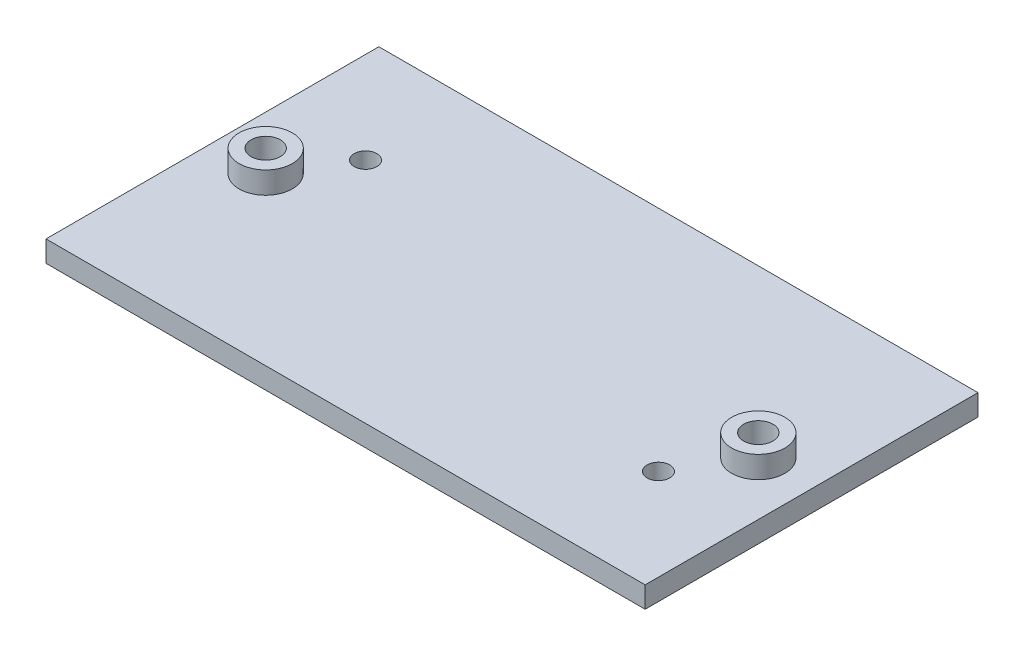
ISO-10303-21;
HEADER;
FILE_DESCRIPTION(('STEP AP214'),'2;1');
FILE_NAME('part.step','',(''),(''),'','','');
FILE_SCHEMA(('AUTOMOTIVE_DESIGN { 1 0 10303 214 1 1 1 1 }'));
ENDSEC;
DATA;
#1=APPLICATION_CONTEXT('core data for automotive mechanical design processes');
#2=APPLICATION_PROTOCOL_DEFINITION('international standard','automotive_design',2000,#1);
#3=PRODUCT_CONTEXT('',#1,'mechanical');
#4=PRODUCT('Part','Part','',(#3));
#5=PRODUCT_RELATED_PRODUCT_CATEGORY('part','',(#4));
#6=PRODUCT_DEFINITION_FORMATION('','',#4);
#7=PRODUCT_DEFINITION_CONTEXT('part definition',#1,'design');
#8=PRODUCT_DEFINITION('design','',#6,#7);
#9=PRODUCT_DEFINITION_SHAPE('','',#8);
#10=(LENGTH_UNIT() NAMED_UNIT(*) SI_UNIT(.MILLI.,.METRE.));
#11=(NAMED_UNIT(*) PLANE_ANGLE_UNIT() SI_UNIT($,.RADIAN.));
#12=(NAMED_UNIT(*) SI_UNIT($,.STERADIAN.) SOLID_ANGLE_UNIT());
#13=UNCERTAINTY_MEASURE_WITH_UNIT(LENGTH_MEASURE(1.E-05),#10,'distance_accuracy_value','');
#14=(GEOMETRIC_REPRESENTATION_CONTEXT(3) GLOBAL_UNCERTAINTY_ASSIGNED_CONTEXT((#13)) GLOBAL_UNIT_ASSIGNED_CONTEXT((#10,
#11,#12)) REPRESENTATION_CONTEXT('',''));
#15=CARTESIAN_POINT('',(0.,0.,0.));
#16=DIRECTION('',(0.,0.,1.));
#17=DIRECTION('',(1.,0.,0.));
#18=AXIS2_PLACEMENT_3D('',#15,#16,#17);
#19=CARTESIAN_POINT('',(0.,95.75,0.));
#20=DIRECTION('',(0.,-1.,0.));
#21=DIRECTION('',(0.,0.,-1.));
#22=AXIS2_PLACEMENT_3D('',#19,#20,#21);
#23=PLANE('',#22);
#24=CARTESIAN_POINT('',(-37.,95.75,0.));
#25=DIRECTION('',(0.,1.,0.));
#26=DIRECTION('',(0.,0.,1.));
#27=AXIS2_PLACEMENT_3D('',#24,#25,#26);
#28=CIRCLE('',#27,4.);
#29=CARTESIAN_POINT('',(-37.,95.75,-4.));
#30=VERTEX_POINT('',#29);
#31=EDGE_CURVE('E11',#30,#30,#28,.T.);
#32=ORIENTED_EDGE('',*,*,#31,.F.);
#33=EDGE_LOOP('',(#32));
#34=FACE_BOUND('',#33,.T.);
#35=CARTESIAN_POINT('',(37.,95.75,0.));
#36=DIRECTION('',(0.,1.,0.));
#37=DIRECTION('',(0.,0.,1.));
#38=AXIS2_PLACEMENT_3D('',#35,#36,#37);
#39=CIRCLE('',#38,4.);
#40=CARTESIAN_POINT('',(37.,95.75,-4.));
#41=VERTEX_POINT('',#40);
#42=EDGE_CURVE('E51',#41,#41,#39,.T.);
#43=ORIENTED_EDGE('',*,*,#42,.F.);
#44=EDGE_LOOP('',(#43));
#45=FACE_BOUND('',#44,.T.);
#46=DIRECTION('',(0.,0.,1.));
#47=VECTOR('',#46,1.);
#48=CARTESIAN_POINT('',(-45.,95.75,25.));
#49=LINE('',#48,#47);
#50=CARTESIAN_POINT('',(-45.,95.75,-25.));
#51=VERTEX_POINT('',#50);
#52=CARTESIAN_POINT('',(-45.,95.75,25.));
#53=VERTEX_POINT('',#52);
#54=EDGE_CURVE('E96',#51,#53,#49,.T.);
#55=ORIENTED_EDGE('',*,*,#54,.T.);
#56=DIRECTION('',(1.,0.,0.));
#57=VECTOR('',#56,1.);
#58=CARTESIAN_POINT('',(45.,95.75,25.));
#59=LINE('',#58,#57);
#60=CARTESIAN_POINT('',(45.,95.75,25.));
#61=VERTEX_POINT('',#60);
#62=EDGE_CURVE('E93',#53,#61,#59,.T.);
#63=ORIENTED_EDGE('',*,*,#62,.T.);
#64=DIRECTION('',(0.,0.,-1.));
#65=VECTOR('',#64,1.);
#66=CARTESIAN_POINT('',(45.,95.75,-25.));
#67=LINE('',#66,#65);
#68=CARTESIAN_POINT('',(45.,95.75,-25.));
#69=VERTEX_POINT('',#68);
#70=EDGE_CURVE('E94',#61,#69,#67,.T.);
#71=ORIENTED_EDGE('',*,*,#70,.T.);
#72=DIRECTION('',(-1.,0.,0.));
#73=VECTOR('',#72,1.);
#74=CARTESIAN_POINT('',(-45.,95.75,-25.));
#75=LINE('',#74,#73);
#76=EDGE_CURVE('E58',#69,#51,#75,.T.);
#77=ORIENTED_EDGE('',*,*,#76,.T.);
#78=EDGE_LOOP('',(#55,#63,#71,#77));
#79=FACE_BOUND('',#78,.T.);
#80=CARTESIAN_POINT('',(-31.25,95.75,-9.25));
#81=DIRECTION('',(0.,1.,0.));
#82=DIRECTION('',(0.,0.,1.));
#83=AXIS2_PLACEMENT_3D('',#80,#81,#82);
#84=CIRCLE('',#83,1.7);
#85=CARTESIAN_POINT('',(-31.25,95.75,-7.55));
#86=VERTEX_POINT('',#85);
#87=EDGE_CURVE('E129',#86,#86,#84,.T.);
#88=ORIENTED_EDGE('',*,*,#87,.F.);
#89=EDGE_LOOP('',(#88));
#90=FACE_BOUND('',#89,.T.);
#91=CARTESIAN_POINT('',(31.25,95.75,9.25));
#92=DIRECTION('',(0.,1.,0.));
#93=DIRECTION('',(0.,0.,1.));
#94=AXIS2_PLACEMENT_3D('',#91,#92,#93);
#95=CIRCLE('',#94,1.7);
#96=CARTESIAN_POINT('',(31.25,95.75,10.95));
#97=VERTEX_POINT('',#96);
#98=EDGE_CURVE('E135',#97,#97,#95,.T.);
#99=ORIENTED_EDGE('',*,*,#98,.F.);
#100=EDGE_LOOP('',(#99));
#101=FACE_BOUND('',#100,.T.);
#102=ADVANCED_FACE('F41',(#34,#45,#79,#90,#101),#23,.F.);
#103=CARTESIAN_POINT('',(0.,92.57,0.));
#104=DIRECTION('',(0.,-1.,0.));
#105=DIRECTION('',(0.,0.,-1.));
#106=AXIS2_PLACEMENT_3D('',#103,#104,#105);
#107=PLANE('',#106);
#108=CARTESIAN_POINT('',(-31.25,92.57,-9.25));
#109=DIRECTION('',(0.,1.,0.));
#110=DIRECTION('',(0.,0.,1.));
#111=AXIS2_PLACEMENT_3D('',#108,#109,#110);
#112=CIRCLE('',#111,1.7);
#113=CARTESIAN_POINT('',(-31.25,92.57,-7.55));
#114=VERTEX_POINT('',#113);
#115=EDGE_CURVE('E128',#114,#114,#112,.T.);
#116=ORIENTED_EDGE('',*,*,#115,.T.);
#117=EDGE_LOOP('',(#116));
#118=FACE_BOUND('',#117,.T.);
#119=CARTESIAN_POINT('',(-37.,92.57,0.));
#120=DIRECTION('',(0.,1.,0.));
#121=DIRECTION('',(0.,0.,1.));
#122=AXIS2_PLACEMENT_3D('',#119,#120,#121);
#123=CIRCLE('',#122,2.2);
#124=CARTESIAN_POINT('',(-37.,92.57,2.2));
#125=VERTEX_POINT('',#124);
#126=EDGE_CURVE('E115',#125,#125,#123,.T.);
#127=ORIENTED_EDGE('',*,*,#126,.T.);
#128=EDGE_LOOP('',(#127));
#129=FACE_BOUND('',#128,.T.);
#130=DIRECTION('',(0.,0.,1.));
#131=VECTOR('',#130,1.);
#132=CARTESIAN_POINT('',(-45.,92.57,25.));
#133=LINE('',#132,#131);
#134=CARTESIAN_POINT('',(-45.,92.57,-25.));
#135=VERTEX_POINT('',#134);
#136=CARTESIAN_POINT('',(-45.,92.57,25.));
#137=VERTEX_POINT('',#136);
#138=EDGE_CURVE('E108',#135,#137,#133,.T.);
#139=ORIENTED_EDGE('',*,*,#138,.F.);
#140=DIRECTION('',(-1.,0.,0.));
#141=VECTOR('',#140,1.);
#142=CARTESIAN_POINT('',(-45.,92.57,-25.));
#143=LINE('',#142,#141);
#144=CARTESIAN_POINT('',(45.,92.57,-25.));
#145=VERTEX_POINT('',#144);
#146=EDGE_CURVE('E84',#145,#135,#143,.T.);
#147=ORIENTED_EDGE('',*,*,#146,.F.);
#148=DIRECTION('',(0.,0.,-1.));
#149=VECTOR('',#148,1.);
#150=CARTESIAN_POINT('',(45.,92.57,-25.));
#151=LINE('',#150,#149);
#152=CARTESIAN_POINT('',(45.,92.57,25.));
#153=VERTEX_POINT('',#152);
#154=EDGE_CURVE('E76',#153,#145,#151,.T.);
#155=ORIENTED_EDGE('',*,*,#154,.F.);
#156=DIRECTION('',(1.,0.,0.));
#157=VECTOR('',#156,1.);
#158=CARTESIAN_POINT('',(45.,92.57,25.));
#159=LINE('',#158,#157);
#160=EDGE_CURVE('E101',#137,#153,#159,.T.);
#161=ORIENTED_EDGE('',*,*,#160,.F.);
#162=EDGE_LOOP('',(#139,#147,#155,#161));
#163=FACE_BOUND('',#162,.T.);
#164=CARTESIAN_POINT('',(37.,92.57,0.));
#165=DIRECTION('',(0.,1.,0.));
#166=DIRECTION('',(0.,0.,1.));
#167=AXIS2_PLACEMENT_3D('',#164,#165,#166);
#168=CIRCLE('',#167,2.2);
#169=CARTESIAN_POINT('',(37.,92.57,2.2));
#170=VERTEX_POINT('',#169);
#171=EDGE_CURVE('E127',#170,#170,#168,.T.);
#172=ORIENTED_EDGE('',*,*,#171,.T.);
#173=EDGE_LOOP('',(#172));
#174=FACE_BOUND('',#173,.T.);
#175=CARTESIAN_POINT('',(31.25,92.57,9.25));
#176=DIRECTION('',(0.,1.,0.));
#177=DIRECTION('',(0.,0.,1.));
#178=AXIS2_PLACEMENT_3D('',#175,#176,#177);
#179=CIRCLE('',#178,1.7);
#180=CARTESIAN_POINT('',(31.25,92.57,10.95));
#181=VERTEX_POINT('',#180);
#182=EDGE_CURVE('E136',#181,#181,#179,.T.);
#183=ORIENTED_EDGE('',*,*,#182,.T.);
#184=EDGE_LOOP('',(#183));
#185=FACE_BOUND('',#184,.T.);
#186=ADVANCED_FACE('F117',(#118,#129,#163,#174,#185),#107,.T.);
#187=CARTESIAN_POINT('',(-45.,95.75,25.));
#188=DIRECTION('',(1.,0.,0.));
#189=DIRECTION('',(0.,0.,-1.));
#190=AXIS2_PLACEMENT_3D('',#187,#188,#189);
#191=PLANE('',#190);
#192=ORIENTED_EDGE('',*,*,#138,.T.);
#193=DIRECTION('',(0.,-1.,0.));
#194=VECTOR('',#193,1.);
#195=CARTESIAN_POINT('',(-45.,95.75,25.));
#196=LINE('',#195,#194);
#197=EDGE_CURVE('E44',#53,#137,#196,.T.);
#198=ORIENTED_EDGE('',*,*,#197,.F.);
#199=ORIENTED_EDGE('',*,*,#54,.F.);
#200=DIRECTION('',(0.,-1.,0.));
#201=VECTOR('',#200,1.);
#202=CARTESIAN_POINT('',(-45.,95.75,-25.));
#203=LINE('',#202,#201);
#204=EDGE_CURVE('E104',#51,#135,#203,.T.);
#205=ORIENTED_EDGE('',*,*,#204,.T.);
#206=EDGE_LOOP('',(#192,#198,#199,#205));
#207=FACE_BOUND('',#206,.T.);
#208=ADVANCED_FACE('F43',(#207),#191,.F.);
#209=CARTESIAN_POINT('',(45.,95.75,25.));
#210=DIRECTION('',(0.,0.,-1.));
#211=DIRECTION('',(-1.,0.,0.));
#212=AXIS2_PLACEMENT_3D('',#209,#210,#211);
#213=PLANE('',#212);
#214=ORIENTED_EDGE('',*,*,#160,.T.);
#215=DIRECTION('',(0.,-1.,0.));
#216=VECTOR('',#215,1.);
#217=CARTESIAN_POINT('',(45.,95.75,25.));
#218=LINE('',#217,#216);
#219=EDGE_CURVE('E97',#61,#153,#218,.T.);
#220=ORIENTED_EDGE('',*,*,#219,.F.);
#221=ORIENTED_EDGE('',*,*,#62,.F.);
#222=ORIENTED_EDGE('',*,*,#197,.T.);
#223=EDGE_LOOP('',(#214,#220,#221,#222));
#224=FACE_BOUND('',#223,.T.);
#225=ADVANCED_FACE('F99',(#224),#213,.F.);
#226=CARTESIAN_POINT('',(45.,95.75,-25.));
#227=DIRECTION('',(-1.,0.,0.));
#228=DIRECTION('',(0.,0.,1.));
#229=AXIS2_PLACEMENT_3D('',#226,#227,#228);
#230=PLANE('',#229);
#231=ORIENTED_EDGE('',*,*,#154,.T.);
#232=DIRECTION('',(0.,-1.,0.));
#233=VECTOR('',#232,1.);
#234=CARTESIAN_POINT('',(45.,95.75,-25.));
#235=LINE('',#234,#233);
#236=EDGE_CURVE('E105',#69,#145,#235,.T.);
#237=ORIENTED_EDGE('',*,*,#236,.F.);
#238=ORIENTED_EDGE('',*,*,#70,.F.);
#239=ORIENTED_EDGE('',*,*,#219,.T.);
#240=EDGE_LOOP('',(#231,#237,#238,#239));
#241=FACE_BOUND('',#240,.T.);
#242=ADVANCED_FACE('F103',(#241),#230,.F.);
#243=CARTESIAN_POINT('',(-45.,95.75,-25.));
#244=DIRECTION('',(0.,0.,1.));
#245=DIRECTION('',(1.,0.,0.));
#246=AXIS2_PLACEMENT_3D('',#243,#244,#245);
#247=PLANE('',#246);
#248=ORIENTED_EDGE('',*,*,#146,.T.);
#249=ORIENTED_EDGE('',*,*,#204,.F.);
#250=ORIENTED_EDGE('',*,*,#76,.F.);
#251=ORIENTED_EDGE('',*,*,#236,.T.);
#252=EDGE_LOOP('',(#248,#249,#250,#251));
#253=FACE_BOUND('',#252,.T.);
#254=ADVANCED_FACE('F116',(#253),#247,.F.);
#255=CARTESIAN_POINT('',(-37.,95.75,0.));
#256=DIRECTION('',(0.,-1.,0.));
#257=DIRECTION('',(0.,0.,-1.));
#258=AXIS2_PLACEMENT_3D('',#255,#256,#257);
#259=CYLINDRICAL_SURFACE('',#258,2.2);
#260=ORIENTED_EDGE('',*,*,#126,.F.);
#261=EDGE_LOOP('',(#260));
#262=FACE_BOUND('',#261,.T.);
#263=CARTESIAN_POINT('',(-37.,99.05,0.));
#264=DIRECTION('',(0.,1.,0.));
#265=DIRECTION('',(0.,0.,1.));
#266=AXIS2_PLACEMENT_3D('',#263,#264,#265);
#267=CIRCLE('',#266,2.2);
#268=CARTESIAN_POINT('',(-37.,99.05,2.2));
#269=VERTEX_POINT('',#268);
#270=EDGE_CURVE('E144',#269,#269,#267,.T.);
#271=ORIENTED_EDGE('',*,*,#270,.T.);
#272=EDGE_LOOP('',(#271));
#273=FACE_BOUND('',#272,.T.);
#274=ADVANCED_FACE('F156',(#262,#273),#259,.F.);
#275=CARTESIAN_POINT('',(37.,95.75,0.));
#276=DIRECTION('',(0.,-1.,0.));
#277=DIRECTION('',(0.,0.,-1.));
#278=AXIS2_PLACEMENT_3D('',#275,#276,#277);
#279=CYLINDRICAL_SURFACE('',#278,2.2);
#280=ORIENTED_EDGE('',*,*,#171,.F.);
#281=EDGE_LOOP('',(#280));
#282=FACE_BOUND('',#281,.T.);
#283=CARTESIAN_POINT('',(37.,99.05,0.));
#284=DIRECTION('',(0.,1.,0.));
#285=DIRECTION('',(0.,0.,1.));
#286=AXIS2_PLACEMENT_3D('',#283,#284,#285);
#287=CIRCLE('',#286,2.2);
#288=CARTESIAN_POINT('',(37.,99.05,2.2));
#289=VERTEX_POINT('',#288);
#290=EDGE_CURVE('E142',#289,#289,#287,.T.);
#291=ORIENTED_EDGE('',*,*,#290,.T.);
#292=EDGE_LOOP('',(#291));
#293=FACE_BOUND('',#292,.T.);
#294=ADVANCED_FACE('F228',(#282,#293),#279,.F.);
#295=CARTESIAN_POINT('',(-31.25,95.75,-9.25));
#296=DIRECTION('',(0.,-1.,0.));
#297=DIRECTION('',(0.,0.,-1.));
#298=AXIS2_PLACEMENT_3D('',#295,#296,#297);
#299=CYLINDRICAL_SURFACE('',#298,1.7);
#300=ORIENTED_EDGE('',*,*,#87,.T.);
#301=EDGE_LOOP('',(#300));
#302=FACE_BOUND('',#301,.T.);
#303=ORIENTED_EDGE('',*,*,#115,.F.);
#304=EDGE_LOOP('',(#303));
#305=FACE_BOUND('',#304,.T.);
#306=ADVANCED_FACE('F236',(#302,#305),#299,.F.);
#307=CARTESIAN_POINT('',(31.25,95.75,9.25));
#308=DIRECTION('',(0.,-1.,0.));
#309=DIRECTION('',(0.,0.,-1.));
#310=AXIS2_PLACEMENT_3D('',#307,#308,#309);
#311=CYLINDRICAL_SURFACE('',#310,1.7);
#312=ORIENTED_EDGE('',*,*,#98,.T.);
#313=EDGE_LOOP('',(#312));
#314=FACE_BOUND('',#313,.T.);
#315=ORIENTED_EDGE('',*,*,#182,.F.);
#316=EDGE_LOOP('',(#315));
#317=FACE_BOUND('',#316,.T.);
#318=ADVANCED_FACE('F247',(#314,#317),#311,.F.);
#319=CARTESIAN_POINT('',(37.,99.05,0.));
#320=DIRECTION('',(0.,1.,0.));
#321=DIRECTION('',(0.,0.,1.));
#322=AXIS2_PLACEMENT_3D('',#319,#320,#321);
#323=PLANE('',#322);
#324=CARTESIAN_POINT('',(37.,99.05,0.));
#325=DIRECTION('',(0.,1.,0.));
#326=DIRECTION('',(0.,0.,1.));
#327=AXIS2_PLACEMENT_3D('',#324,#325,#326);
#328=CIRCLE('',#327,4.);
#329=CARTESIAN_POINT('',(37.,99.05,-4.));
#330=VERTEX_POINT('',#329);
#331=EDGE_CURVE('E148',#330,#330,#328,.T.);
#332=ORIENTED_EDGE('',*,*,#331,.T.);
#333=EDGE_LOOP('',(#332));
#334=FACE_BOUND('',#333,.T.);
#335=ORIENTED_EDGE('',*,*,#290,.F.);
#336=EDGE_LOOP('',(#335));
#337=FACE_BOUND('',#336,.T.);
#338=ADVANCED_FACE('F168',(#334,#337),#323,.T.);
#339=CARTESIAN_POINT('',(37.,99.05,0.));
#340=DIRECTION('',(0.,-1.,0.));
#341=DIRECTION('',(0.,0.,-1.));
#342=AXIS2_PLACEMENT_3D('',#339,#340,#341);
#343=CYLINDRICAL_SURFACE('',#342,4.);
#344=CARTESIAN_POINT('',(37.,99.05,-4.));
#345=CARTESIAN_POINT('',(37.,99.015625,-4.));
#346=CARTESIAN_POINT('',(37.,98.98125,-4.));
#347=CARTESIAN_POINT('',(37.,98.9125,-4.));
#348=CARTESIAN_POINT('',(37.,98.878125,-4.));
#349=CARTESIAN_POINT('',(37.,98.809375,-4.));
#350=CARTESIAN_POINT('',(37.,98.775,-4.));
#351=CARTESIAN_POINT('',(37.,98.70625,-4.));
#352=CARTESIAN_POINT('',(37.,98.671875,-4.));
#353=CARTESIAN_POINT('',(37.,98.603125,-4.));
#354=CARTESIAN_POINT('',(37.,98.56875,-4.));
#355=CARTESIAN_POINT('',(37.,98.5,-4.));
#356=CARTESIAN_POINT('',(37.,98.465625,-4.));
#357=CARTESIAN_POINT('',(37.,98.396875,-4.));
#358=CARTESIAN_POINT('',(37.,98.3625,-4.));
#359=CARTESIAN_POINT('',(37.,98.29375,-4.));
#360=CARTESIAN_POINT('',(37.,98.259375,-4.));
#361=CARTESIAN_POINT('',(37.,98.190625,-4.));
#362=CARTESIAN_POINT('',(37.,98.15625,-4.));
#363=CARTESIAN_POINT('',(37.,98.0875,-4.));
#364=CARTESIAN_POINT('',(37.,98.053125,-4.));
#365=CARTESIAN_POINT('',(37.,97.984375,-4.));
#366=CARTESIAN_POINT('',(37.,97.95,-4.));
#367=CARTESIAN_POINT('',(37.,97.88125,-4.));
#368=CARTESIAN_POINT('',(37.,97.846875,-4.));
#369=CARTESIAN_POINT('',(37.,97.778125,-4.));
#370=CARTESIAN_POINT('',(37.,97.74375,-4.));
#371=CARTESIAN_POINT('',(37.,97.675,-4.));
#372=CARTESIAN_POINT('',(37.,97.640625,-4.));
#373=CARTESIAN_POINT('',(37.,97.571875,-4.));
#374=CARTESIAN_POINT('',(37.,97.5375,-4.));
#375=CARTESIAN_POINT('',(37.,97.46875,-4.));
#376=CARTESIAN_POINT('',(37.,97.434375,-4.));
#377=CARTESIAN_POINT('',(37.,97.365625,-4.));
#378=CARTESIAN_POINT('',(37.,97.33125,-4.));
#379=CARTESIAN_POINT('',(37.,97.2625,-4.));
#380=CARTESIAN_POINT('',(37.,97.228125,-4.));
#381=CARTESIAN_POINT('',(37.,97.159375,-4.));
#382=CARTESIAN_POINT('',(37.,97.125,-4.));
#383=CARTESIAN_POINT('',(37.,97.05625,-4.));
#384=CARTESIAN_POINT('',(37.,97.021875,-4.));
#385=CARTESIAN_POINT('',(37.,96.953125,-4.));
#386=CARTESIAN_POINT('',(37.,96.91875,-4.));
#387=CARTESIAN_POINT('',(37.,96.85,-4.));
#388=CARTESIAN_POINT('',(37.,96.815625,-4.));
#389=CARTESIAN_POINT('',(37.,96.746875,-4.));
#390=CARTESIAN_POINT('',(37.,96.7125,-4.));
#391=CARTESIAN_POINT('',(37.,96.64375,-4.));
#392=CARTESIAN_POINT('',(37.,96.609375,-4.));
#393=CARTESIAN_POINT('',(37.,96.540625,-4.));
#394=CARTESIAN_POINT('',(37.,96.50625,-4.));
#395=CARTESIAN_POINT('',(37.,96.4375,-4.));
#396=CARTESIAN_POINT('',(37.,96.403125,-4.));
#397=CARTESIAN_POINT('',(37.,96.334375,-4.));
#398=CARTESIAN_POINT('',(37.,96.3,-4.));
#399=CARTESIAN_POINT('',(37.,96.23125,-4.));
#400=CARTESIAN_POINT('',(37.,96.196875,-4.));
#401=CARTESIAN_POINT('',(37.,96.128125,-4.));
#402=CARTESIAN_POINT('',(37.,96.09375,-4.));
#403=CARTESIAN_POINT('',(37.,96.025,-4.));
#404=CARTESIAN_POINT('',(37.,95.990625,-4.));
#405=CARTESIAN_POINT('',(37.,95.921875,-4.));
#406=CARTESIAN_POINT('',(37.,95.8875,-4.));
#407=CARTESIAN_POINT('',(37.,95.81875,-4.));
#408=CARTESIAN_POINT('',(37.,95.784375,-4.));
#409=CARTESIAN_POINT('',(37.,95.75,-4.));
#410=B_SPLINE_CURVE_WITH_KNOTS('',3,(#344,#345,#346,#347,#348,#349,#350,#351,#352,#353,#354,
#355,#356,#357,#358,#359,#360,#361,#362,#363,#364,#365,#366,#367,#368,#369,#370,#371,#372,#373,
#374,#375,#376,#377,#378,#379,#380,#381,#382,#383,#384,#385,#386,#387,#388,#389,#390,#391,#392,
#393,#394,#395,#396,#397,#398,#399,#400,#401,#402,#403,#404,#405,#406,#407,#408,#409),
.UNSPECIFIED.,.F.,.F.,(4,2,2,2,2,2,2,2,2,2,2,2,2,2,2,2,2,2,2,2,2,2,2,2,2,2,2,2,2,2,2,2,4),(0.,
0.103125000000009,0.206250000000005,0.309375000000001,0.41250000000001,0.515625000000006,
0.618750000000001,0.721875000000011,0.825000000000006,0.928125000000002,1.03125000000001,
1.13437500000001,1.2375,1.34062500000001,1.44375000000001,1.546875,1.65000000000001,
1.75312500000001,1.85625,1.959375,2.06250000000001,2.165625,2.26875,2.37187500000001,2.475,
2.578125,2.68125000000001,2.78437500000001,2.8875,2.99062500000001,3.09375000000001,3.196875,
3.30000000000001),.UNSPECIFIED.);
#411=EDGE_CURVE('BSEAM161',#330,#41,#410,.T.);
#412=ORIENTED_EDGE('',*,*,#331,.F.);
#413=ORIENTED_EDGE('',*,*,#42,.T.);
#414=ORIENTED_EDGE('',*,*,#411,.T.);
#415=ORIENTED_EDGE('',*,*,#411,.F.);
#416=EDGE_LOOP('',(#412,#414,#413,#415));
#417=FACE_BOUND('',#416,.T.);
#418=ADVANCED_FACE('F161',(#417),#343,.T.);
#419=CARTESIAN_POINT('',(-37.,99.05,0.));
#420=DIRECTION('',(0.,1.,0.));
#421=DIRECTION('',(0.,0.,1.));
#422=AXIS2_PLACEMENT_3D('',#419,#420,#421);
#423=PLANE('',#422);
#424=CARTESIAN_POINT('',(-37.,99.05,0.));
#425=DIRECTION('',(0.,1.,0.));
#426=DIRECTION('',(0.,0.,1.));
#427=AXIS2_PLACEMENT_3D('',#424,#425,#426);
#428=CIRCLE('',#427,4.);
#429=CARTESIAN_POINT('',(-37.,99.05,-4.));
#430=VERTEX_POINT('',#429);
#431=EDGE_CURVE('E138',#430,#430,#428,.T.);
#432=ORIENTED_EDGE('',*,*,#431,.T.);
#433=EDGE_LOOP('',(#432));
#434=FACE_BOUND('',#433,.T.);
#435=ORIENTED_EDGE('',*,*,#270,.F.);
#436=EDGE_LOOP('',(#435));
#437=FACE_BOUND('',#436,.T.);
#438=ADVANCED_FACE('F158',(#434,#437),#423,.T.);
#439=CARTESIAN_POINT('',(-37.,99.05,0.));
#440=DIRECTION('',(0.,-1.,0.));
#441=DIRECTION('',(0.,0.,-1.));
#442=AXIS2_PLACEMENT_3D('',#439,#440,#441);
#443=CYLINDRICAL_SURFACE('',#442,4.);
#444=CARTESIAN_POINT('',(-37.,99.05,-4.));
#445=CARTESIAN_POINT('',(-37.,99.015625,-4.));
#446=CARTESIAN_POINT('',(-37.,98.98125,-4.));
#447=CARTESIAN_POINT('',(-37.,98.9125,-4.));
#448=CARTESIAN_POINT('',(-37.,98.878125,-4.));
#449=CARTESIAN_POINT('',(-37.,98.809375,-4.));
#450=CARTESIAN_POINT('',(-37.,98.775,-4.));
#451=CARTESIAN_POINT('',(-37.,98.70625,-4.));
#452=CARTESIAN_POINT('',(-37.,98.671875,-4.));
#453=CARTESIAN_POINT('',(-37.,98.603125,-4.));
#454=CARTESIAN_POINT('',(-37.,98.56875,-4.));
#455=CARTESIAN_POINT('',(-37.,98.5,-4.));
#456=CARTESIAN_POINT('',(-37.,98.465625,-4.));
#457=CARTESIAN_POINT('',(-37.,98.396875,-4.));
#458=CARTESIAN_POINT('',(-37.,98.3625,-4.));
#459=CARTESIAN_POINT('',(-37.,98.29375,-4.));
#460=CARTESIAN_POINT('',(-37.,98.259375,-4.));
#461=CARTESIAN_POINT('',(-37.,98.190625,-4.));
#462=CARTESIAN_POINT('',(-37.,98.15625,-4.));
#463=CARTESIAN_POINT('',(-37.,98.0875,-4.));
#464=CARTESIAN_POINT('',(-37.,98.053125,-4.));
#465=CARTESIAN_POINT('',(-37.,97.984375,-4.));
#466=CARTESIAN_POINT('',(-37.,97.95,-4.));
#467=CARTESIAN_POINT('',(-37.,97.88125,-4.));
#468=CARTESIAN_POINT('',(-37.,97.846875,-4.));
#469=CARTESIAN_POINT('',(-37.,97.778125,-4.));
#470=CARTESIAN_POINT('',(-37.,97.74375,-4.));
#471=CARTESIAN_POINT('',(-37.,97.675,-4.));
#472=CARTESIAN_POINT('',(-37.,97.640625,-4.));
#473=CARTESIAN_POINT('',(-37.,97.571875,-4.));
#474=CARTESIAN_POINT('',(-37.,97.5375,-4.));
#475=CARTESIAN_POINT('',(-37.,97.46875,-4.));
#476=CARTESIAN_POINT('',(-37.,97.434375,-4.));
#477=CARTESIAN_POINT('',(-37.,97.365625,-4.));
#478=CARTESIAN_POINT('',(-37.,97.33125,-4.));
#479=CARTESIAN_POINT('',(-37.,97.2625,-4.));
#480=CARTESIAN_POINT('',(-37.,97.228125,-4.));
#481=CARTESIAN_POINT('',(-37.,97.159375,-4.));
#482=CARTESIAN_POINT('',(-37.,97.125,-4.));
#483=CARTESIAN_POINT('',(-37.,97.05625,-4.));
#484=CARTESIAN_POINT('',(-37.,97.021875,-4.));
#485=CARTESIAN_POINT('',(-37.,96.953125,-4.));
#486=CARTESIAN_POINT('',(-37.,96.91875,-4.));
#487=CARTESIAN_POINT('',(-37.,96.85,-4.));
#488=CARTESIAN_POINT('',(-37.,96.815625,-4.));
#489=CARTESIAN_POINT('',(-37.,96.746875,-4.));
#490=CARTESIAN_POINT('',(-37.,96.7125,-4.));
#491=CARTESIAN_POINT('',(-37.,96.64375,-4.));
#492=CARTESIAN_POINT('',(-37.,96.609375,-4.));
#493=CARTESIAN_POINT('',(-37.,96.540625,-4.));
#494=CARTESIAN_POINT('',(-37.,96.50625,-4.));
#495=CARTESIAN_POINT('',(-37.,96.4375,-4.));
#496=CARTESIAN_POINT('',(-37.,96.403125,-4.));
#497=CARTESIAN_POINT('',(-37.,96.334375,-4.));
#498=CARTESIAN_POINT('',(-37.,96.3,-4.));
#499=CARTESIAN_POINT('',(-37.,96.23125,-4.));
#500=CARTESIAN_POINT('',(-37.,96.196875,-4.));
#501=CARTESIAN_POINT('',(-37.,96.128125,-4.));
#502=CARTESIAN_POINT('',(-37.,96.09375,-4.));
#503=CARTESIAN_POINT('',(-37.,96.025,-4.));
#504=CARTESIAN_POINT('',(-37.,95.990625,-4.));
#505=CARTESIAN_POINT('',(-37.,95.921875,-4.));
#506=CARTESIAN_POINT('',(-37.,95.8875,-4.));
#507=CARTESIAN_POINT('',(-37.,95.81875,-4.));
#508=CARTESIAN_POINT('',(-37.,95.784375,-4.));
#509=CARTESIAN_POINT('',(-37.,95.75,-4.));
#510=B_SPLINE_CURVE_WITH_KNOTS('',3,(#444,#445,#446,#447,#448,#449,#450,#451,#452,#453,#454,
#455,#456,#457,#458,#459,#460,#461,#462,#463,#464,#465,#466,#467,#468,#469,#470,#471,#472,#473,
#474,#475,#476,#477,#478,#479,#480,#481,#482,#483,#484,#485,#486,#487,#488,#489,#490,#491,#492,
#493,#494,#495,#496,#497,#498,#499,#500,#501,#502,#503,#504,#505,#506,#507,#508,#509),
.UNSPECIFIED.,.F.,.F.,(4,2,2,2,2,2,2,2,2,2,2,2,2,2,2,2,2,2,2,2,2,2,2,2,2,2,2,2,2,2,2,2,4),(0.,
0.103125000000009,0.206250000000005,0.309375000000001,0.41250000000001,0.515625000000006,
0.618750000000001,0.721875000000011,0.825000000000006,0.928125000000002,1.03125000000001,
1.13437500000001,1.2375,1.34062500000001,1.44375000000001,1.546875,1.65000000000001,
1.75312500000001,1.85625,1.959375,2.06250000000001,2.165625,2.26875,2.37187500000001,2.475,
2.578125,2.68125000000001,2.78437500000001,2.8875,2.99062500000001,3.09375000000001,3.196875,
3.30000000000001),.UNSPECIFIED.);
#511=EDGE_CURVE('BSEAM159',#430,#30,#510,.T.);
#512=ORIENTED_EDGE('',*,*,#431,.F.);
#513=ORIENTED_EDGE('',*,*,#31,.T.);
#514=ORIENTED_EDGE('',*,*,#511,.T.);
#515=ORIENTED_EDGE('',*,*,#511,.F.);
#516=EDGE_LOOP('',(#512,#514,#513,#515));
#517=FACE_BOUND('',#516,.T.);
#518=ADVANCED_FACE('F159',(#517),#443,.T.);
#519=CLOSED_SHELL('',(#102,#186,#208,#225,#242,#254,#274,#294,#306,#318,#338,#418,#438,#518));
#520=MANIFOLD_SOLID_BREP('B2',#519);
#521=ADVANCED_BREP_SHAPE_REPRESENTATION('',(#18,#520),#14);
#522=SHAPE_DEFINITION_REPRESENTATION(#9,#521);
ENDSEC;
END-ISO-10303-21;
